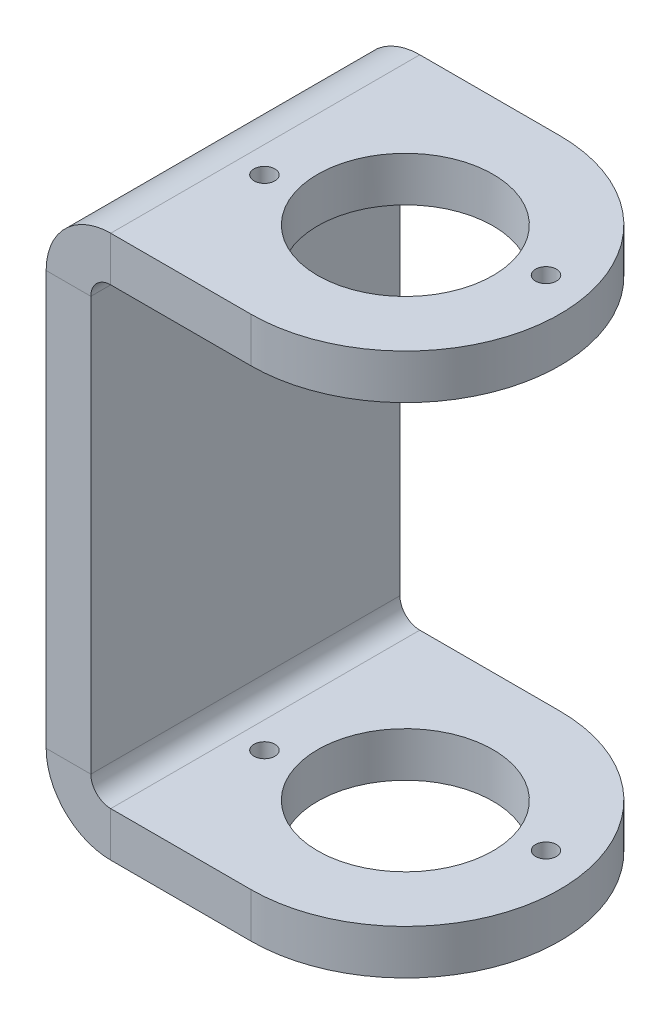
ISO-10303-21;
HEADER;
FILE_DESCRIPTION(('STEP AP214'),'2;1');
FILE_NAME('part.step','',(''),(''),'','','');
FILE_SCHEMA(('AUTOMOTIVE_DESIGN { 1 0 10303 214 1 1 1 1 }'));
ENDSEC;
DATA;
#1=APPLICATION_CONTEXT('core data for automotive mechanical design processes');
#2=APPLICATION_PROTOCOL_DEFINITION('international standard','automotive_design',2000,#1);
#3=PRODUCT_CONTEXT('',#1,'mechanical');
#4=PRODUCT('Part','Part','',(#3));
#5=PRODUCT_RELATED_PRODUCT_CATEGORY('part','',(#4));
#6=PRODUCT_DEFINITION_FORMATION('','',#4);
#7=PRODUCT_DEFINITION_CONTEXT('part definition',#1,'design');
#8=PRODUCT_DEFINITION('design','',#6,#7);
#9=PRODUCT_DEFINITION_SHAPE('','',#8);
#10=(LENGTH_UNIT() NAMED_UNIT(*) SI_UNIT(.MILLI.,.METRE.));
#11=(NAMED_UNIT(*) PLANE_ANGLE_UNIT() SI_UNIT($,.RADIAN.));
#12=(NAMED_UNIT(*) SI_UNIT($,.STERADIAN.) SOLID_ANGLE_UNIT());
#13=UNCERTAINTY_MEASURE_WITH_UNIT(LENGTH_MEASURE(1.E-05),#10,'distance_accuracy_value','');
#14=(GEOMETRIC_REPRESENTATION_CONTEXT(3) GLOBAL_UNCERTAINTY_ASSIGNED_CONTEXT((#13)) GLOBAL_UNIT_ASSIGNED_CONTEXT((#10,
#11,#12)) REPRESENTATION_CONTEXT('',''));
#15=CARTESIAN_POINT('',(0.,0.,0.));
#16=DIRECTION('',(0.,0.,1.));
#17=DIRECTION('',(1.,0.,0.));
#18=AXIS2_PLACEMENT_3D('',#15,#16,#17);
#19=CARTESIAN_POINT('',(0.,-32.5,18.5));
#20=DIRECTION('',(0.,1.,0.));
#21=DIRECTION('',(0.,0.,1.));
#22=AXIS2_PLACEMENT_3D('',#19,#20,#21);
#23=PLANE('',#22);
#24=CARTESIAN_POINT('',(24.5,-32.5,0.));
#25=DIRECTION('',(0.,1.,0.));
#26=DIRECTION('',(0.,0.,1.));
#27=AXIS2_PLACEMENT_3D('',#24,#25,#26);
#28=CIRCLE('',#27,10.5);
#29=CARTESIAN_POINT('',(24.5,-32.5,10.5));
#30=VERTEX_POINT('',#29);
#31=EDGE_CURVE('E327',#30,#30,#28,.T.);
#32=ORIENTED_EDGE('',*,*,#31,.T.);
#33=EDGE_LOOP('',(#32));
#34=FACE_BOUND('',#33,.T.);
#35=DIRECTION('',(1.,0.,0.));
#36=VECTOR('',#35,1.);
#37=CARTESIAN_POINT('',(0.,-32.5,-18.5));
#38=LINE('',#37,#36);
#39=CARTESIAN_POINT('',(7.730000066,-32.5,-18.5));
#40=VERTEX_POINT('',#39);
#41=CARTESIAN_POINT('',(24.5,-32.5,-18.5));
#42=VERTEX_POINT('',#41);
#43=EDGE_CURVE('E208',#40,#42,#38,.T.);
#44=ORIENTED_EDGE('',*,*,#43,.T.);
#45=CARTESIAN_POINT('',(24.5,-32.5,0.));
#46=DIRECTION('',(0.,1.,0.));
#47=DIRECTION('',(0.,0.,1.));
#48=AXIS2_PLACEMENT_3D('',#45,#46,#47);
#49=CIRCLE('',#48,18.5);
#50=CARTESIAN_POINT('',(24.5,-32.5,18.5));
#51=VERTEX_POINT('',#50);
#52=EDGE_CURVE('E11',#42,#51,#49,.F.);
#53=ORIENTED_EDGE('',*,*,#52,.T.);
#54=DIRECTION('',(1.,0.,0.));
#55=VECTOR('',#54,1.);
#56=CARTESIAN_POINT('',(0.,-32.5,18.5));
#57=LINE('',#56,#55);
#58=CARTESIAN_POINT('',(7.730000066,-32.5,18.5));
#59=VERTEX_POINT('',#58);
#60=EDGE_CURVE('E175',#59,#51,#57,.T.);
#61=ORIENTED_EDGE('',*,*,#60,.F.);
#62=DIRECTION('',(0.,0.,-1.));
#63=VECTOR('',#62,1.);
#64=CARTESIAN_POINT('',(7.730000066,-32.5,18.5));
#65=LINE('',#64,#63);
#66=EDGE_CURVE('E207',#59,#40,#65,.T.);
#67=ORIENTED_EDGE('',*,*,#66,.T.);
#68=EDGE_LOOP('',(#44,#53,#61,#67));
#69=FACE_BOUND('',#68,.T.);
#70=CARTESIAN_POINT('',(38.127028289396,-32.5,-3.21));
#71=DIRECTION('',(0.,-1.,0.));
#72=DIRECTION('',(0.,0.,-1.));
#73=AXIS2_PLACEMENT_3D('',#70,#71,#72);
#74=CIRCLE('',#73,1.24999999999999);
#75=CARTESIAN_POINT('',(38.127028289396,-32.5,-4.45999999999999));
#76=VERTEX_POINT('',#75);
#77=EDGE_CURVE('E355',#76,#76,#74,.T.);
#78=ORIENTED_EDGE('',*,*,#77,.F.);
#79=EDGE_LOOP('',(#78));
#80=FACE_BOUND('',#79,.T.);
#81=CARTESIAN_POINT('',(10.8824561686037,-32.5,3.25));
#82=DIRECTION('',(0.,-1.,0.));
#83=DIRECTION('',(0.,0.,-1.));
#84=AXIS2_PLACEMENT_3D('',#81,#82,#83);
#85=CIRCLE('',#84,1.24999999999999);
#86=CARTESIAN_POINT('',(10.8824561686037,-32.5,2.00000000000001));
#87=VERTEX_POINT('',#86);
#88=EDGE_CURVE('E363',#87,#87,#85,.T.);
#89=ORIENTED_EDGE('',*,*,#88,.F.);
#90=EDGE_LOOP('',(#89));
#91=FACE_BOUND('',#90,.T.);
#92=ADVANCED_FACE('F51',(#34,#69,#80,#91),#23,.F.);
#93=CARTESIAN_POINT('',(0.,32.5,18.5));
#94=DIRECTION('',(0.,-1.,0.));
#95=DIRECTION('',(1.,0.,0.));
#96=AXIS2_PLACEMENT_3D('',#93,#94,#95);
#97=PLANE('',#96);
#98=CARTESIAN_POINT('',(24.5,32.5,0.));
#99=DIRECTION('',(0.,1.,0.));
#100=DIRECTION('',(0.,0.,1.));
#101=AXIS2_PLACEMENT_3D('',#98,#99,#100);
#102=CIRCLE('',#101,10.5);
#103=CARTESIAN_POINT('',(24.5,32.5,10.5));
#104=VERTEX_POINT('',#103);
#105=EDGE_CURVE('E331',#104,#104,#102,.T.);
#106=ORIENTED_EDGE('',*,*,#105,.F.);
#107=EDGE_LOOP('',(#106));
#108=FACE_BOUND('',#107,.T.);
#109=DIRECTION('',(-1.,0.,0.));
#110=VECTOR('',#109,1.);
#111=CARTESIAN_POINT('',(0.,32.5,18.5));
#112=LINE('',#111,#110);
#113=CARTESIAN_POINT('',(24.5,32.5,18.5));
#114=VERTEX_POINT('',#113);
#115=CARTESIAN_POINT('',(7.73000006599999,32.5,18.5));
#116=VERTEX_POINT('',#115);
#117=EDGE_CURVE('E194',#114,#116,#112,.T.);
#118=ORIENTED_EDGE('',*,*,#117,.F.);
#119=CARTESIAN_POINT('',(24.5,32.5,0.));
#120=DIRECTION('',(0.,-1.,0.));
#121=DIRECTION('',(1.,0.,0.));
#122=AXIS2_PLACEMENT_3D('',#119,#120,#121);
#123=CIRCLE('',#122,18.5);
#124=CARTESIAN_POINT('',(24.5,32.5,-18.5));
#125=VERTEX_POINT('',#124);
#126=EDGE_CURVE('E299',#114,#125,#123,.F.);
#127=ORIENTED_EDGE('',*,*,#126,.T.);
#128=DIRECTION('',(-1.,0.,0.));
#129=VECTOR('',#128,1.);
#130=CARTESIAN_POINT('',(0.,32.5,-18.5));
#131=LINE('',#130,#129);
#132=CARTESIAN_POINT('',(7.73000006599999,32.5,-18.5));
#133=VERTEX_POINT('',#132);
#134=EDGE_CURVE('E228',#125,#133,#131,.T.);
#135=ORIENTED_EDGE('',*,*,#134,.T.);
#136=DIRECTION('',(0.,0.,-1.));
#137=VECTOR('',#136,1.);
#138=CARTESIAN_POINT('',(7.73000006599999,32.5,18.5));
#139=LINE('',#138,#137);
#140=EDGE_CURVE('E254',#116,#133,#139,.T.);
#141=ORIENTED_EDGE('',*,*,#140,.F.);
#142=EDGE_LOOP('',(#118,#127,#135,#141));
#143=FACE_BOUND('',#142,.T.);
#144=CARTESIAN_POINT('',(10.8824561686037,32.5,3.25));
#145=DIRECTION('',(0.,1.,0.));
#146=DIRECTION('',(0.,0.,1.));
#147=AXIS2_PLACEMENT_3D('',#144,#145,#146);
#148=CIRCLE('',#147,1.24999999999999);
#149=CARTESIAN_POINT('',(10.8824561686037,32.5,4.49999999999999));
#150=VERTEX_POINT('',#149);
#151=EDGE_CURVE('E339',#150,#150,#148,.T.);
#152=ORIENTED_EDGE('',*,*,#151,.F.);
#153=EDGE_LOOP('',(#152));
#154=FACE_BOUND('',#153,.T.);
#155=CARTESIAN_POINT('',(38.127028289396,32.5,-3.21));
#156=DIRECTION('',(0.,1.,0.));
#157=DIRECTION('',(0.,0.,1.));
#158=AXIS2_PLACEMENT_3D('',#155,#156,#157);
#159=CIRCLE('',#158,1.24999999999999);
#160=CARTESIAN_POINT('',(38.127028289396,32.5,-1.96000000000001));
#161=VERTEX_POINT('',#160);
#162=EDGE_CURVE('E347',#161,#161,#159,.T.);
#163=ORIENTED_EDGE('',*,*,#162,.F.);
#164=EDGE_LOOP('',(#163));
#165=FACE_BOUND('',#164,.T.);
#166=ADVANCED_FACE('F372',(#108,#143,#154,#165),#97,.F.);
#167=CARTESIAN_POINT('',(24.5,-27.15,0.));
#168=DIRECTION('',(0.,-1.,0.));
#169=DIRECTION('',(0.,0.,-1.));
#170=AXIS2_PLACEMENT_3D('',#167,#168,#169);
#171=CYLINDRICAL_SURFACE('',#170,18.5);
#172=DIRECTION('',(0.,-1.,0.));
#173=VECTOR('',#172,1.);
#174=CARTESIAN_POINT('',(24.5,-24.769999934,-18.5));
#175=LINE('',#174,#173);
#176=CARTESIAN_POINT('',(24.5,-27.15,-18.5));
#177=VERTEX_POINT('',#176);
#178=EDGE_CURVE('E302',#177,#42,#175,.T.);
#179=ORIENTED_EDGE('',*,*,#178,.F.);
#180=CARTESIAN_POINT('',(24.5,-27.15,0.));
#181=DIRECTION('',(0.,1.,0.));
#182=DIRECTION('',(0.,0.,1.));
#183=AXIS2_PLACEMENT_3D('',#180,#181,#182);
#184=CIRCLE('',#183,18.5);
#185=CARTESIAN_POINT('',(24.5,-27.15,18.5));
#186=VERTEX_POINT('',#185);
#187=EDGE_CURVE('E61',#186,#177,#184,.T.);
#188=ORIENTED_EDGE('',*,*,#187,.F.);
#189=DIRECTION('',(0.,-1.,0.));
#190=VECTOR('',#189,1.);
#191=CARTESIAN_POINT('',(24.5,-24.769999934,18.5));
#192=LINE('',#191,#190);
#193=EDGE_CURVE('E173',#51,#186,#192,.F.);
#194=ORIENTED_EDGE('',*,*,#193,.F.);
#195=ORIENTED_EDGE('',*,*,#52,.F.);
#196=EDGE_LOOP('',(#179,#188,#194,#195));
#197=FACE_BOUND('',#196,.T.);
#198=ADVANCED_FACE('F54',(#197),#171,.T.);
#199=CARTESIAN_POINT('',(24.5,27.15,0.));
#200=DIRECTION('',(0.,-1.,0.));
#201=DIRECTION('',(1.,0.,0.));
#202=AXIS2_PLACEMENT_3D('',#199,#200,#201);
#203=CYLINDRICAL_SURFACE('',#202,18.5);
#204=DIRECTION('',(0.,-1.,0.));
#205=VECTOR('',#204,1.);
#206=CARTESIAN_POINT('',(24.5,24.769999934,18.5));
#207=LINE('',#206,#205);
#208=CARTESIAN_POINT('',(24.5,27.15,18.5));
#209=VERTEX_POINT('',#208);
#210=EDGE_CURVE('E288',#209,#114,#207,.F.);
#211=ORIENTED_EDGE('',*,*,#210,.F.);
#212=CARTESIAN_POINT('',(24.5,27.15,0.));
#213=DIRECTION('',(0.,-1.,0.));
#214=DIRECTION('',(1.,0.,0.));
#215=AXIS2_PLACEMENT_3D('',#212,#213,#214);
#216=CIRCLE('',#215,18.5);
#217=CARTESIAN_POINT('',(24.5,27.15,-18.5));
#218=VERTEX_POINT('',#217);
#219=EDGE_CURVE('E296',#218,#209,#216,.T.);
#220=ORIENTED_EDGE('',*,*,#219,.F.);
#221=DIRECTION('',(0.,1.,0.));
#222=VECTOR('',#221,1.);
#223=CARTESIAN_POINT('',(24.5,27.15,-18.5));
#224=LINE('',#223,#222);
#225=EDGE_CURVE('E292',#125,#218,#224,.F.);
#226=ORIENTED_EDGE('',*,*,#225,.F.);
#227=ORIENTED_EDGE('',*,*,#126,.F.);
#228=EDGE_LOOP('',(#211,#220,#226,#227));
#229=FACE_BOUND('',#228,.T.);
#230=ADVANCED_FACE('F407',(#229),#203,.T.);
#231=CARTESIAN_POINT('',(7.73000006599999,32.5,18.5));
#232=DIRECTION('',(0.,0.,1.));
#233=DIRECTION('',(1.,0.,0.));
#234=AXIS2_PLACEMENT_3D('',#231,#232,#233);
#235=PLANE('',#234);
#236=DIRECTION('',(0.,-1.,0.));
#237=VECTOR('',#236,1.);
#238=CARTESIAN_POINT('',(7.73000006599999,32.5,18.5));
#239=LINE('',#238,#237);
#240=CARTESIAN_POINT('',(7.73000006599999,27.15,18.5));
#241=VERTEX_POINT('',#240);
#242=EDGE_CURVE('E284',#116,#241,#239,.T.);
#243=ORIENTED_EDGE('',*,*,#242,.F.);
#244=CARTESIAN_POINT('',(7.73000006599999,24.769999934,18.5));
#245=DIRECTION('',(0.,0.,-1.));
#246=DIRECTION('',(-1.,0.,0.));
#247=AXIS2_PLACEMENT_3D('',#244,#245,#246);
#248=CIRCLE('',#247,7.730000066);
#249=CARTESIAN_POINT('',(0.,24.769999934,18.5));
#250=VERTEX_POINT('',#249);
#251=EDGE_CURVE('E197',#116,#250,#248,.F.);
#252=ORIENTED_EDGE('',*,*,#251,.T.);
#253=DIRECTION('',(-1.,0.,0.));
#254=VECTOR('',#253,1.);
#255=CARTESIAN_POINT('',(5.34999999999999,24.769999934,18.5));
#256=LINE('',#255,#254);
#257=CARTESIAN_POINT('',(5.34999999999999,24.769999934,18.5));
#258=VERTEX_POINT('',#257);
#259=EDGE_CURVE('E281',#258,#250,#256,.T.);
#260=ORIENTED_EDGE('',*,*,#259,.F.);
#261=CARTESIAN_POINT('',(7.73000006599999,24.769999934,18.5));
#262=DIRECTION('',(0.,0.,1.));
#263=DIRECTION('',(1.,0.,0.));
#264=AXIS2_PLACEMENT_3D('',#261,#262,#263);
#265=CIRCLE('',#264,2.380000066);
#266=EDGE_CURVE('E184',#241,#258,#265,.T.);
#267=ORIENTED_EDGE('',*,*,#266,.F.);
#268=EDGE_LOOP('',(#243,#252,#260,#267));
#269=FACE_BOUND('',#268,.T.);
#270=ADVANCED_FACE('F404',(#269),#235,.T.);
#271=CARTESIAN_POINT('',(5.34999999999999,24.769999934,18.5));
#272=DIRECTION('',(0.,0.,1.));
#273=DIRECTION('',(1.,0.,0.));
#274=AXIS2_PLACEMENT_3D('',#271,#272,#273);
#275=PLANE('',#274);
#276=DIRECTION('',(-1.,0.,0.));
#277=VECTOR('',#276,1.);
#278=CARTESIAN_POINT('',(0.,27.15,18.5));
#279=LINE('',#278,#277);
#280=EDGE_CURVE('E191',#209,#241,#279,.T.);
#281=ORIENTED_EDGE('',*,*,#280,.F.);
#282=ORIENTED_EDGE('',*,*,#210,.T.);
#283=ORIENTED_EDGE('',*,*,#117,.T.);
#284=ORIENTED_EDGE('',*,*,#242,.T.);
#285=EDGE_LOOP('',(#281,#282,#283,#284));
#286=FACE_BOUND('',#285,.T.);
#287=ADVANCED_FACE('F400',(#286),#275,.T.);
#288=CARTESIAN_POINT('',(0.,24.769999934,-18.5));
#289=DIRECTION('',(0.,0.,-1.));
#290=DIRECTION('',(-1.,0.,0.));
#291=AXIS2_PLACEMENT_3D('',#288,#289,#290);
#292=PLANE('',#291);
#293=DIRECTION('',(1.,0.,0.));
#294=VECTOR('',#293,1.);
#295=CARTESIAN_POINT('',(0.,24.769999934,-18.5));
#296=LINE('',#295,#294);
#297=CARTESIAN_POINT('',(0.,24.769999934,-18.5));
#298=VERTEX_POINT('',#297);
#299=CARTESIAN_POINT('',(5.34999999999999,24.769999934,-18.5));
#300=VERTEX_POINT('',#299);
#301=EDGE_CURVE('E278',#298,#300,#296,.T.);
#302=ORIENTED_EDGE('',*,*,#301,.F.);
#303=CARTESIAN_POINT('',(7.73000006599999,24.769999934,-18.5));
#304=DIRECTION('',(0.,0.,-1.));
#305=DIRECTION('',(-1.,0.,0.));
#306=AXIS2_PLACEMENT_3D('',#303,#304,#305);
#307=CIRCLE('',#306,7.730000066);
#308=EDGE_CURVE('E231',#133,#298,#307,.F.);
#309=ORIENTED_EDGE('',*,*,#308,.F.);
#310=DIRECTION('',(0.,1.,0.));
#311=VECTOR('',#310,1.);
#312=CARTESIAN_POINT('',(7.73000006599999,27.15,-18.5));
#313=LINE('',#312,#311);
#314=CARTESIAN_POINT('',(7.73000006599999,27.15,-18.5));
#315=VERTEX_POINT('',#314);
#316=EDGE_CURVE('E274',#315,#133,#313,.T.);
#317=ORIENTED_EDGE('',*,*,#316,.F.);
#318=CARTESIAN_POINT('',(7.73000006599999,24.769999934,-18.5));
#319=DIRECTION('',(0.,0.,1.));
#320=DIRECTION('',(1.,0.,0.));
#321=AXIS2_PLACEMENT_3D('',#318,#319,#320);
#322=CIRCLE('',#321,2.380000066);
#323=EDGE_CURVE('E221',#315,#300,#322,.T.);
#324=ORIENTED_EDGE('',*,*,#323,.T.);
#325=EDGE_LOOP('',(#302,#309,#317,#324));
#326=FACE_BOUND('',#325,.T.);
#327=ADVANCED_FACE('F396',(#326),#292,.T.);
#328=CARTESIAN_POINT('',(7.73000006599999,27.15,-18.5));
#329=DIRECTION('',(0.,0.,-1.));
#330=DIRECTION('',(-1.,0.,0.));
#331=AXIS2_PLACEMENT_3D('',#328,#329,#330);
#332=PLANE('',#331);
#333=DIRECTION('',(0.,-1.,0.));
#334=VECTOR('',#333,1.);
#335=CARTESIAN_POINT('',(0.,-32.5,-18.5));
#336=LINE('',#335,#334);
#337=CARTESIAN_POINT('',(0.,-24.769999934,-18.5));
#338=VERTEX_POINT('',#337);
#339=EDGE_CURVE('E235',#298,#338,#336,.T.);
#340=ORIENTED_EDGE('',*,*,#339,.F.);
#341=ORIENTED_EDGE('',*,*,#301,.T.);
#342=DIRECTION('',(0.,-1.,0.));
#343=VECTOR('',#342,1.);
#344=CARTESIAN_POINT('',(5.35,-32.5,-18.5));
#345=LINE('',#344,#343);
#346=CARTESIAN_POINT('',(5.35,-24.769999934,-18.5));
#347=VERTEX_POINT('',#346);
#348=EDGE_CURVE('E217',#300,#347,#345,.T.);
#349=ORIENTED_EDGE('',*,*,#348,.T.);
#350=DIRECTION('',(-1.,0.,0.));
#351=VECTOR('',#350,1.);
#352=CARTESIAN_POINT('',(5.35,-24.769999934,-18.5));
#353=LINE('',#352,#351);
#354=EDGE_CURVE('E169',#347,#338,#353,.T.);
#355=ORIENTED_EDGE('',*,*,#354,.T.);
#356=EDGE_LOOP('',(#340,#341,#349,#355));
#357=FACE_BOUND('',#356,.T.);
#358=ADVANCED_FACE('F393',(#357),#332,.T.);
#359=CARTESIAN_POINT('',(0.,-24.769999934,18.5));
#360=DIRECTION('',(0.,0.,1.));
#361=DIRECTION('',(1.,0.,0.));
#362=AXIS2_PLACEMENT_3D('',#359,#360,#361);
#363=PLANE('',#362);
#364=DIRECTION('',(1.,0.,0.));
#365=VECTOR('',#364,1.);
#366=CARTESIAN_POINT('',(0.,-24.769999934,18.5));
#367=LINE('',#366,#365);
#368=CARTESIAN_POINT('',(0.,-24.769999934,18.5));
#369=VERTEX_POINT('',#368);
#370=CARTESIAN_POINT('',(5.35,-24.769999934,18.5));
#371=VERTEX_POINT('',#370);
#372=EDGE_CURVE('E153',#369,#371,#367,.T.);
#373=ORIENTED_EDGE('',*,*,#372,.F.);
#374=CARTESIAN_POINT('',(7.730000066,-24.769999934,18.5));
#375=DIRECTION('',(0.,0.,-1.));
#376=DIRECTION('',(-1.,0.,0.));
#377=AXIS2_PLACEMENT_3D('',#374,#375,#376);
#378=CIRCLE('',#377,7.730000066);
#379=EDGE_CURVE('E147',#369,#59,#378,.F.);
#380=ORIENTED_EDGE('',*,*,#379,.T.);
#381=DIRECTION('',(0.,-1.,0.));
#382=VECTOR('',#381,1.);
#383=CARTESIAN_POINT('',(7.730000066,-27.15,18.5));
#384=LINE('',#383,#382);
#385=CARTESIAN_POINT('',(7.730000066,-27.15,18.5));
#386=VERTEX_POINT('',#385);
#387=EDGE_CURVE('E140',#386,#59,#384,.T.);
#388=ORIENTED_EDGE('',*,*,#387,.F.);
#389=CARTESIAN_POINT('',(7.730000066,-24.769999934,18.5));
#390=DIRECTION('',(0.,0.,1.));
#391=DIRECTION('',(1.,0.,0.));
#392=AXIS2_PLACEMENT_3D('',#389,#390,#391);
#393=CIRCLE('',#392,2.380000066);
#394=EDGE_CURVE('E144',#371,#386,#393,.T.);
#395=ORIENTED_EDGE('',*,*,#394,.F.);
#396=EDGE_LOOP('',(#373,#380,#388,#395));
#397=FACE_BOUND('',#396,.T.);
#398=ADVANCED_FACE('F142',(#397),#363,.T.);
#399=CARTESIAN_POINT('',(7.730000066,-27.15,18.5));
#400=DIRECTION('',(0.,0.,1.));
#401=DIRECTION('',(1.,0.,0.));
#402=AXIS2_PLACEMENT_3D('',#399,#400,#401);
#403=PLANE('',#402);
#404=DIRECTION('',(0.,-1.,0.));
#405=VECTOR('',#404,1.);
#406=CARTESIAN_POINT('',(0.,-32.5,18.5));
#407=LINE('',#406,#405);
#408=EDGE_CURVE('E201',#250,#369,#407,.T.);
#409=ORIENTED_EDGE('',*,*,#408,.T.);
#410=ORIENTED_EDGE('',*,*,#372,.T.);
#411=DIRECTION('',(0.,-1.,0.));
#412=VECTOR('',#411,1.);
#413=CARTESIAN_POINT('',(5.35,-32.5,18.5));
#414=LINE('',#413,#412);
#415=EDGE_CURVE('E181',#258,#371,#414,.T.);
#416=ORIENTED_EDGE('',*,*,#415,.F.);
#417=ORIENTED_EDGE('',*,*,#259,.T.);
#418=EDGE_LOOP('',(#409,#410,#416,#417));
#419=FACE_BOUND('',#418,.T.);
#420=ADVANCED_FACE('F387',(#419),#403,.T.);
#421=CARTESIAN_POINT('',(7.730000066,-32.5,-18.5));
#422=DIRECTION('',(0.,0.,-1.));
#423=DIRECTION('',(-1.,0.,0.));
#424=AXIS2_PLACEMENT_3D('',#421,#422,#423);
#425=PLANE('',#424);
#426=DIRECTION('',(0.,1.,0.));
#427=VECTOR('',#426,1.);
#428=CARTESIAN_POINT('',(7.730000066,-32.5,-18.5));
#429=LINE('',#428,#427);
#430=CARTESIAN_POINT('',(7.730000066,-27.15,-18.5));
#431=VERTEX_POINT('',#430);
#432=EDGE_CURVE('E154',#40,#431,#429,.T.);
#433=ORIENTED_EDGE('',*,*,#432,.F.);
#434=CARTESIAN_POINT('',(7.730000066,-24.769999934,-18.5));
#435=DIRECTION('',(0.,0.,-1.));
#436=DIRECTION('',(-1.,0.,0.));
#437=AXIS2_PLACEMENT_3D('',#434,#435,#436);
#438=CIRCLE('',#437,7.730000066);
#439=EDGE_CURVE('E239',#338,#40,#438,.F.);
#440=ORIENTED_EDGE('',*,*,#439,.F.);
#441=ORIENTED_EDGE('',*,*,#354,.F.);
#442=CARTESIAN_POINT('',(7.730000066,-24.769999934,-18.5));
#443=DIRECTION('',(0.,0.,1.));
#444=DIRECTION('',(1.,0.,0.));
#445=AXIS2_PLACEMENT_3D('',#442,#443,#444);
#446=CIRCLE('',#445,2.380000066);
#447=EDGE_CURVE('E214',#347,#431,#446,.T.);
#448=ORIENTED_EDGE('',*,*,#447,.T.);
#449=EDGE_LOOP('',(#433,#440,#441,#448));
#450=FACE_BOUND('',#449,.T.);
#451=ADVANCED_FACE('F313',(#450),#425,.T.);
#452=CARTESIAN_POINT('',(5.35,-24.769999934,-18.5));
#453=DIRECTION('',(0.,0.,-1.));
#454=DIRECTION('',(-1.,0.,0.));
#455=AXIS2_PLACEMENT_3D('',#452,#453,#454);
#456=PLANE('',#455);
#457=DIRECTION('',(1.,0.,0.));
#458=VECTOR('',#457,1.);
#459=CARTESIAN_POINT('',(0.,-27.15,-18.5));
#460=LINE('',#459,#458);
#461=EDGE_CURVE('E164',#431,#177,#460,.T.);
#462=ORIENTED_EDGE('',*,*,#461,.T.);
#463=ORIENTED_EDGE('',*,*,#178,.T.);
#464=ORIENTED_EDGE('',*,*,#43,.F.);
#465=ORIENTED_EDGE('',*,*,#432,.T.);
#466=EDGE_LOOP('',(#462,#463,#464,#465));
#467=FACE_BOUND('',#466,.T.);
#468=ADVANCED_FACE('F310',(#467),#456,.T.);
#469=CARTESIAN_POINT('',(0.,-27.15,18.5));
#470=DIRECTION('',(0.,1.,0.));
#471=DIRECTION('',(0.,0.,1.));
#472=AXIS2_PLACEMENT_3D('',#469,#470,#471);
#473=PLANE('',#472);
#474=CARTESIAN_POINT('',(10.8824561686037,-27.15,3.25));
#475=DIRECTION('',(0.,1.,0.));
#476=DIRECTION('',(0.,0.,1.));
#477=AXIS2_PLACEMENT_3D('',#474,#475,#476);
#478=CIRCLE('',#477,1.24999999999999);
#479=CARTESIAN_POINT('',(10.8824561686037,-27.15,4.49999999999999));
#480=VERTEX_POINT('',#479);
#481=EDGE_CURVE('E359',#480,#480,#478,.T.);
#482=ORIENTED_EDGE('',*,*,#481,.F.);
#483=EDGE_LOOP('',(#482));
#484=FACE_BOUND('',#483,.T.);
#485=CARTESIAN_POINT('',(38.127028289396,-27.15,-3.21));
#486=DIRECTION('',(0.,1.,0.));
#487=DIRECTION('',(0.,0.,1.));
#488=AXIS2_PLACEMENT_3D('',#485,#486,#487);
#489=CIRCLE('',#488,1.24999999999999);
#490=CARTESIAN_POINT('',(38.127028289396,-27.15,-1.96000000000001));
#491=VERTEX_POINT('',#490);
#492=EDGE_CURVE('E351',#491,#491,#489,.T.);
#493=ORIENTED_EDGE('',*,*,#492,.F.);
#494=EDGE_LOOP('',(#493));
#495=FACE_BOUND('',#494,.T.);
#496=CARTESIAN_POINT('',(24.5,-27.15,0.));
#497=DIRECTION('',(0.,1.,0.));
#498=DIRECTION('',(0.,0.,1.));
#499=AXIS2_PLACEMENT_3D('',#496,#497,#498);
#500=CIRCLE('',#499,10.5);
#501=CARTESIAN_POINT('',(24.5,-27.15,10.5));
#502=VERTEX_POINT('',#501);
#503=EDGE_CURVE('E211',#502,#502,#500,.T.);
#504=ORIENTED_EDGE('',*,*,#503,.F.);
#505=EDGE_LOOP('',(#504));
#506=FACE_BOUND('',#505,.T.);
#507=DIRECTION('',(1.,0.,0.));
#508=VECTOR('',#507,1.);
#509=CARTESIAN_POINT('',(0.,-27.15,18.5));
#510=LINE('',#509,#508);
#511=EDGE_CURVE('E162',#386,#186,#510,.T.);
#512=ORIENTED_EDGE('',*,*,#511,.T.);
#513=ORIENTED_EDGE('',*,*,#187,.T.);
#514=ORIENTED_EDGE('',*,*,#461,.F.);
#515=DIRECTION('',(0.,0.,-1.));
#516=VECTOR('',#515,1.);
#517=CARTESIAN_POINT('',(7.730000066,-27.15,18.5));
#518=LINE('',#517,#516);
#519=EDGE_CURVE('E160',#386,#431,#518,.T.);
#520=ORIENTED_EDGE('',*,*,#519,.F.);
#521=EDGE_LOOP('',(#512,#513,#514,#520));
#522=FACE_BOUND('',#521,.T.);
#523=ADVANCED_FACE('F161',(#484,#495,#506,#522),#473,.T.);
#524=CARTESIAN_POINT('',(7.730000066,-24.769999934,18.5));
#525=DIRECTION('',(0.,0.,-1.));
#526=DIRECTION('',(-1.,0.,0.));
#527=AXIS2_PLACEMENT_3D('',#524,#525,#526);
#528=CYLINDRICAL_SURFACE('',#527,2.380000066);
#529=ORIENTED_EDGE('',*,*,#447,.F.);
#530=DIRECTION('',(0.,0.,-1.));
#531=VECTOR('',#530,1.);
#532=CARTESIAN_POINT('',(5.35,-24.769999934,18.5));
#533=LINE('',#532,#531);
#534=EDGE_CURVE('E170',#371,#347,#533,.T.);
#535=ORIENTED_EDGE('',*,*,#534,.F.);
#536=ORIENTED_EDGE('',*,*,#394,.T.);
#537=ORIENTED_EDGE('',*,*,#519,.T.);
#538=EDGE_LOOP('',(#529,#535,#536,#537));
#539=FACE_BOUND('',#538,.T.);
#540=ADVANCED_FACE('F178',(#539),#528,.F.);
#541=CARTESIAN_POINT('',(5.35,-32.5,18.5));
#542=DIRECTION('',(1.,0.,0.));
#543=DIRECTION('',(0.,1.,0.));
#544=AXIS2_PLACEMENT_3D('',#541,#542,#543);
#545=PLANE('',#544);
#546=ORIENTED_EDGE('',*,*,#348,.F.);
#547=DIRECTION('',(0.,0.,-1.));
#548=VECTOR('',#547,1.);
#549=CARTESIAN_POINT('',(5.34999999999999,24.769999934,18.5));
#550=LINE('',#549,#548);
#551=EDGE_CURVE('E262',#258,#300,#550,.T.);
#552=ORIENTED_EDGE('',*,*,#551,.F.);
#553=ORIENTED_EDGE('',*,*,#415,.T.);
#554=ORIENTED_EDGE('',*,*,#534,.T.);
#555=EDGE_LOOP('',(#546,#552,#553,#554));
#556=FACE_BOUND('',#555,.T.);
#557=ADVANCED_FACE('F443',(#556),#545,.T.);
#558=CARTESIAN_POINT('',(7.73000006599999,24.769999934,18.5));
#559=DIRECTION('',(0.,0.,-1.));
#560=DIRECTION('',(-1.,0.,0.));
#561=AXIS2_PLACEMENT_3D('',#558,#559,#560);
#562=CYLINDRICAL_SURFACE('',#561,2.380000066);
#563=ORIENTED_EDGE('',*,*,#323,.F.);
#564=DIRECTION('',(0.,0.,-1.));
#565=VECTOR('',#564,1.);
#566=CARTESIAN_POINT('',(7.73000006599999,27.15,18.5));
#567=LINE('',#566,#565);
#568=EDGE_CURVE('E258',#241,#315,#567,.T.);
#569=ORIENTED_EDGE('',*,*,#568,.F.);
#570=ORIENTED_EDGE('',*,*,#266,.T.);
#571=ORIENTED_EDGE('',*,*,#551,.T.);
#572=EDGE_LOOP('',(#563,#569,#570,#571));
#573=FACE_BOUND('',#572,.T.);
#574=ADVANCED_FACE('F448',(#573),#562,.F.);
#575=CARTESIAN_POINT('',(0.,27.15,18.5));
#576=DIRECTION('',(0.,-1.,0.));
#577=DIRECTION('',(1.,0.,0.));
#578=AXIS2_PLACEMENT_3D('',#575,#576,#577);
#579=PLANE('',#578);
#580=CARTESIAN_POINT('',(38.127028289396,27.15,-3.21));
#581=DIRECTION('',(0.,-1.,0.));
#582=DIRECTION('',(1.,0.,0.));
#583=AXIS2_PLACEMENT_3D('',#580,#581,#582);
#584=CIRCLE('',#583,1.25);
#585=CARTESIAN_POINT('',(39.377028289396,27.15,-3.21));
#586=VERTEX_POINT('',#585);
#587=EDGE_CURVE('E343',#586,#586,#584,.T.);
#588=ORIENTED_EDGE('',*,*,#587,.F.);
#589=EDGE_LOOP('',(#588));
#590=FACE_BOUND('',#589,.T.);
#591=CARTESIAN_POINT('',(10.8824561686037,27.15,3.25));
#592=DIRECTION('',(0.,-1.,0.));
#593=DIRECTION('',(1.,0.,0.));
#594=AXIS2_PLACEMENT_3D('',#591,#592,#593);
#595=CIRCLE('',#594,1.25);
#596=CARTESIAN_POINT('',(12.1324561686037,27.15,3.25));
#597=VERTEX_POINT('',#596);
#598=EDGE_CURVE('E335',#597,#597,#595,.T.);
#599=ORIENTED_EDGE('',*,*,#598,.F.);
#600=EDGE_LOOP('',(#599));
#601=FACE_BOUND('',#600,.T.);
#602=CARTESIAN_POINT('',(24.5,27.15,0.));
#603=DIRECTION('',(0.,-1.,0.));
#604=DIRECTION('',(1.,0.,0.));
#605=AXIS2_PLACEMENT_3D('',#602,#603,#604);
#606=CIRCLE('',#605,10.5);
#607=CARTESIAN_POINT('',(35.,27.15,0.));
#608=VERTEX_POINT('',#607);
#609=EDGE_CURVE('E323',#608,#608,#606,.T.);
#610=ORIENTED_EDGE('',*,*,#609,.F.);
#611=EDGE_LOOP('',(#610));
#612=FACE_BOUND('',#611,.T.);
#613=DIRECTION('',(-1.,0.,0.));
#614=VECTOR('',#613,1.);
#615=CARTESIAN_POINT('',(0.,27.15,-18.5));
#616=LINE('',#615,#614);
#617=EDGE_CURVE('E225',#218,#315,#616,.T.);
#618=ORIENTED_EDGE('',*,*,#617,.F.);
#619=ORIENTED_EDGE('',*,*,#219,.T.);
#620=ORIENTED_EDGE('',*,*,#280,.T.);
#621=ORIENTED_EDGE('',*,*,#568,.T.);
#622=EDGE_LOOP('',(#618,#619,#620,#621));
#623=FACE_BOUND('',#622,.T.);
#624=ADVANCED_FACE('F425',(#590,#601,#612,#623),#579,.T.);
#625=CARTESIAN_POINT('',(7.73000006599999,24.769999934,18.5));
#626=DIRECTION('',(0.,0.,-1.));
#627=DIRECTION('',(-1.,0.,0.));
#628=AXIS2_PLACEMENT_3D('',#625,#626,#627);
#629=CYLINDRICAL_SURFACE('',#628,7.730000066);
#630=ORIENTED_EDGE('',*,*,#308,.T.);
#631=DIRECTION('',(0.,0.,-1.));
#632=VECTOR('',#631,1.);
#633=CARTESIAN_POINT('',(0.,24.769999934,18.5));
#634=LINE('',#633,#632);
#635=EDGE_CURVE('E250',#250,#298,#634,.T.);
#636=ORIENTED_EDGE('',*,*,#635,.F.);
#637=ORIENTED_EDGE('',*,*,#251,.F.);
#638=ORIENTED_EDGE('',*,*,#140,.T.);
#639=EDGE_LOOP('',(#630,#636,#637,#638));
#640=FACE_BOUND('',#639,.T.);
#641=ADVANCED_FACE('F434',(#640),#629,.T.);
#642=CARTESIAN_POINT('',(0.,-32.5,18.5));
#643=DIRECTION('',(1.,0.,0.));
#644=DIRECTION('',(0.,1.,0.));
#645=AXIS2_PLACEMENT_3D('',#642,#643,#644);
#646=PLANE('',#645);
#647=ORIENTED_EDGE('',*,*,#339,.T.);
#648=DIRECTION('',(0.,0.,-1.));
#649=VECTOR('',#648,1.);
#650=CARTESIAN_POINT('',(0.,-24.769999934,18.5));
#651=LINE('',#650,#649);
#652=EDGE_CURVE('E246',#369,#338,#651,.T.);
#653=ORIENTED_EDGE('',*,*,#652,.F.);
#654=ORIENTED_EDGE('',*,*,#408,.F.);
#655=ORIENTED_EDGE('',*,*,#635,.T.);
#656=EDGE_LOOP('',(#647,#653,#654,#655));
#657=FACE_BOUND('',#656,.T.);
#658=ADVANCED_FACE('F440',(#657),#646,.F.);
#659=CARTESIAN_POINT('',(7.730000066,-24.769999934,18.5));
#660=DIRECTION('',(0.,0.,-1.));
#661=DIRECTION('',(-1.,0.,0.));
#662=AXIS2_PLACEMENT_3D('',#659,#660,#661);
#663=CYLINDRICAL_SURFACE('',#662,7.730000066);
#664=ORIENTED_EDGE('',*,*,#439,.T.);
#665=ORIENTED_EDGE('',*,*,#66,.F.);
#666=ORIENTED_EDGE('',*,*,#379,.F.);
#667=ORIENTED_EDGE('',*,*,#652,.T.);
#668=EDGE_LOOP('',(#664,#665,#666,#667));
#669=FACE_BOUND('',#668,.T.);
#670=ADVANCED_FACE('F315',(#669),#663,.T.);
#671=CARTESIAN_POINT('',(7.730000066,-24.769999934,18.5));
#672=DIRECTION('',(0.,0.,1.));
#673=DIRECTION('',(1.,0.,0.));
#674=AXIS2_PLACEMENT_3D('',#671,#672,#673);
#675=PLANE('',#674);
#676=ORIENTED_EDGE('',*,*,#60,.T.);
#677=ORIENTED_EDGE('',*,*,#193,.T.);
#678=ORIENTED_EDGE('',*,*,#511,.F.);
#679=ORIENTED_EDGE('',*,*,#387,.T.);
#680=EDGE_LOOP('',(#676,#677,#678,#679));
#681=FACE_BOUND('',#680,.T.);
#682=ADVANCED_FACE('F172',(#681),#675,.T.);
#683=CARTESIAN_POINT('',(7.730000066,-24.769999934,-18.5));
#684=DIRECTION('',(0.,0.,1.));
#685=DIRECTION('',(1.,0.,0.));
#686=AXIS2_PLACEMENT_3D('',#683,#684,#685);
#687=PLANE('',#686);
#688=ORIENTED_EDGE('',*,*,#134,.F.);
#689=ORIENTED_EDGE('',*,*,#225,.T.);
#690=ORIENTED_EDGE('',*,*,#617,.T.);
#691=ORIENTED_EDGE('',*,*,#316,.T.);
#692=EDGE_LOOP('',(#688,#689,#690,#691));
#693=FACE_BOUND('',#692,.T.);
#694=ADVANCED_FACE('F430',(#693),#687,.F.);
#695=CARTESIAN_POINT('',(24.5,-32.5,0.));
#696=DIRECTION('',(0.,1.,0.));
#697=DIRECTION('',(0.,0.,1.));
#698=AXIS2_PLACEMENT_3D('',#695,#696,#697);
#699=CYLINDRICAL_SURFACE('',#698,10.5);
#700=ORIENTED_EDGE('',*,*,#609,.T.);
#701=EDGE_LOOP('',(#700));
#702=FACE_BOUND('',#701,.T.);
#703=ORIENTED_EDGE('',*,*,#105,.T.);
#704=EDGE_LOOP('',(#703));
#705=FACE_BOUND('',#704,.T.);
#706=ADVANCED_FACE('F470',(#702,#705),#699,.F.);
#707=ORIENTED_EDGE('',*,*,#503,.T.);
#708=EDGE_LOOP('',(#707));
#709=FACE_BOUND('',#708,.T.);
#710=ORIENTED_EDGE('',*,*,#31,.F.);
#711=EDGE_LOOP('',(#710));
#712=FACE_BOUND('',#711,.T.);
#713=ADVANCED_FACE('F473',(#709,#712),#699,.F.);
#714=CARTESIAN_POINT('',(10.8824561686037,32.5,3.25));
#715=DIRECTION('',(0.,1.,0.));
#716=DIRECTION('',(0.,0.,1.));
#717=AXIS2_PLACEMENT_3D('',#714,#715,#716);
#718=CYLINDRICAL_SURFACE('',#717,1.25);
#719=ORIENTED_EDGE('',*,*,#151,.T.);
#720=EDGE_LOOP('',(#719));
#721=FACE_BOUND('',#720,.T.);
#722=ORIENTED_EDGE('',*,*,#598,.T.);
#723=EDGE_LOOP('',(#722));
#724=FACE_BOUND('',#723,.T.);
#725=ADVANCED_FACE('F459',(#721,#724),#718,.F.);
#726=CARTESIAN_POINT('',(38.127028289396,32.5,-3.21));
#727=DIRECTION('',(0.,1.,0.));
#728=DIRECTION('',(0.,0.,1.));
#729=AXIS2_PLACEMENT_3D('',#726,#727,#728);
#730=CYLINDRICAL_SURFACE('',#729,1.25);
#731=ORIENTED_EDGE('',*,*,#162,.T.);
#732=EDGE_LOOP('',(#731));
#733=FACE_BOUND('',#732,.T.);
#734=ORIENTED_EDGE('',*,*,#587,.T.);
#735=EDGE_LOOP('',(#734));
#736=FACE_BOUND('',#735,.T.);
#737=ADVANCED_FACE('F455',(#733,#736),#730,.F.);
#738=CARTESIAN_POINT('',(38.127028289396,-32.5,-3.21));
#739=DIRECTION('',(0.,-1.,0.));
#740=DIRECTION('',(0.,0.,-1.));
#741=AXIS2_PLACEMENT_3D('',#738,#739,#740);
#742=CYLINDRICAL_SURFACE('',#741,1.24999999999999);
#743=ORIENTED_EDGE('',*,*,#77,.T.);
#744=EDGE_LOOP('',(#743));
#745=FACE_BOUND('',#744,.T.);
#746=ORIENTED_EDGE('',*,*,#492,.T.);
#747=EDGE_LOOP('',(#746));
#748=FACE_BOUND('',#747,.T.);
#749=ADVANCED_FACE('F458',(#745,#748),#742,.F.);
#750=CARTESIAN_POINT('',(10.8824561686037,-32.5,3.25));
#751=DIRECTION('',(0.,-1.,0.));
#752=DIRECTION('',(0.,0.,-1.));
#753=AXIS2_PLACEMENT_3D('',#750,#751,#752);
#754=CYLINDRICAL_SURFACE('',#753,1.24999999999999);
#755=ORIENTED_EDGE('',*,*,#88,.T.);
#756=EDGE_LOOP('',(#755));
#757=FACE_BOUND('',#756,.T.);
#758=ORIENTED_EDGE('',*,*,#481,.T.);
#759=EDGE_LOOP('',(#758));
#760=FACE_BOUND('',#759,.T.);
#761=ADVANCED_FACE('F368',(#757,#760),#754,.F.);
#762=CLOSED_SHELL('',(#92,#166,#198,#230,#270,#287,#327,#358,#398,#420,#451,#468,#523,#540,#557,
#574,#624,#641,#658,#670,#682,#694,#706,#713,#725,#737,#749,#761));
#763=MANIFOLD_SOLID_BREP('B2',#762);
#764=ADVANCED_BREP_SHAPE_REPRESENTATION('',(#18,#763),#14);
#765=SHAPE_DEFINITION_REPRESENTATION(#9,#764);
ENDSEC;
END-ISO-10303-21;
